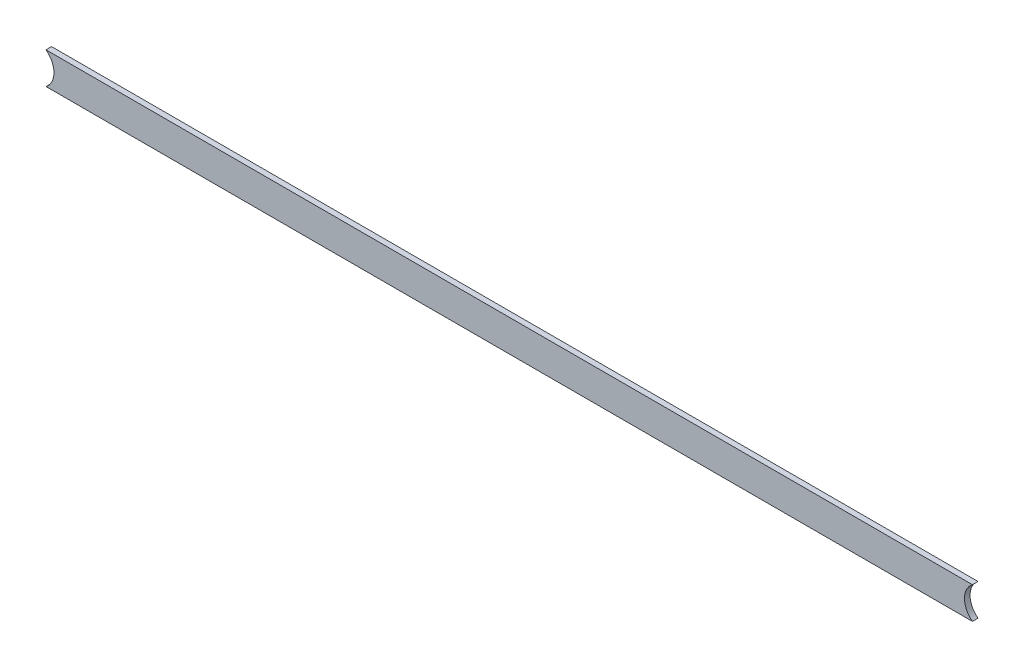
ISO-10303-21;
HEADER;
FILE_DESCRIPTION(('STEP AP214'),'2;1');
FILE_NAME('part.step','',(''),(''),'','','');
FILE_SCHEMA(('AUTOMOTIVE_DESIGN { 1 0 10303 214 1 1 1 1 }'));
ENDSEC;
DATA;
#1=APPLICATION_CONTEXT('core data for automotive mechanical design processes');
#2=APPLICATION_PROTOCOL_DEFINITION('international standard','automotive_design',2000,#1);
#3=PRODUCT_CONTEXT('',#1,'mechanical');
#4=PRODUCT('Part','Part','',(#3));
#5=PRODUCT_RELATED_PRODUCT_CATEGORY('part','',(#4));
#6=PRODUCT_DEFINITION_FORMATION('','',#4);
#7=PRODUCT_DEFINITION_CONTEXT('part definition',#1,'design');
#8=PRODUCT_DEFINITION('design','',#6,#7);
#9=PRODUCT_DEFINITION_SHAPE('','',#8);
#10=(LENGTH_UNIT() NAMED_UNIT(*) SI_UNIT(.MILLI.,.METRE.));
#11=(NAMED_UNIT(*) PLANE_ANGLE_UNIT() SI_UNIT($,.RADIAN.));
#12=(NAMED_UNIT(*) SI_UNIT($,.STERADIAN.) SOLID_ANGLE_UNIT());
#13=UNCERTAINTY_MEASURE_WITH_UNIT(LENGTH_MEASURE(1.E-05),#10,'distance_accuracy_value','');
#14=(GEOMETRIC_REPRESENTATION_CONTEXT(3) GLOBAL_UNCERTAINTY_ASSIGNED_CONTEXT((#13)) GLOBAL_UNIT_ASSIGNED_CONTEXT((#10,
#11,#12)) REPRESENTATION_CONTEXT('',''));
#15=CARTESIAN_POINT('',(0.,0.,0.));
#16=DIRECTION('',(0.,0.,1.));
#17=DIRECTION('',(1.,0.,0.));
#18=AXIS2_PLACEMENT_3D('',#15,#16,#17);
#19=CARTESIAN_POINT('',(86.125,-117.175,-0.035));
#20=DIRECTION('',(0.,1.,0.));
#21=DIRECTION('',(1.,0.,0.));
#22=AXIS2_PLACEMENT_3D('',#19,#20,#21);
#23=PLANE('',#22);
#24=DIRECTION('',(0.,0.,-1.));
#25=VECTOR('',#24,1.);
#26=CARTESIAN_POINT('',(92.025,-117.175,-0.045));
#27=LINE('',#26,#25);
#28=CARTESIAN_POINT('',(92.024999999999,-117.175,0.));
#29=VERTEX_POINT('',#28);
#30=CARTESIAN_POINT('',(92.024999999999,-117.175,-0.035));
#31=VERTEX_POINT('',#30);
#32=EDGE_CURVE('E11',#29,#31,#27,.T.);
#33=ORIENTED_EDGE('',*,*,#32,.F.);
#34=DIRECTION('',(1.,0.,0.));
#35=VECTOR('',#34,1.);
#36=CARTESIAN_POINT('',(86.125,-117.175,0.));
#37=LINE('',#36,#35);
#38=CARTESIAN_POINT('',(86.199999999938,-117.175,0.));
#39=VERTEX_POINT('',#38);
#40=EDGE_CURVE('E26',#39,#29,#37,.T.);
#41=ORIENTED_EDGE('',*,*,#40,.F.);
#42=DIRECTION('',(0.,0.,-1.));
#43=VECTOR('',#42,1.);
#44=CARTESIAN_POINT('',(86.2,-117.175,-0.045));
#45=LINE('',#44,#43);
#46=CARTESIAN_POINT('',(86.199999999938,-117.175,-0.035));
#47=VERTEX_POINT('',#46);
#48=EDGE_CURVE('E109',#39,#47,#45,.T.);
#49=ORIENTED_EDGE('',*,*,#48,.T.);
#50=DIRECTION('',(1.,0.,0.));
#51=VECTOR('',#50,1.);
#52=CARTESIAN_POINT('',(86.125,-117.175,-0.035));
#53=LINE('',#52,#51);
#54=EDGE_CURVE('E88',#47,#31,#53,.T.);
#55=ORIENTED_EDGE('',*,*,#54,.T.);
#56=EDGE_LOOP('',(#33,#41,#49,#55));
#57=FACE_BOUND('',#56,.T.);
#58=ADVANCED_FACE('F17',(#57),#23,.F.);
#59=CARTESIAN_POINT('',(92.1,-117.075,-0.045));
#60=DIRECTION('',(0.,0.,-1.));
#61=DIRECTION('',(0.,-1.,0.));
#62=AXIS2_PLACEMENT_3D('',#59,#60,#61);
#63=CYLINDRICAL_SURFACE('',#62,0.125);
#64=DIRECTION('',(0.,0.,-1.));
#65=VECTOR('',#64,1.);
#66=CARTESIAN_POINT('',(92.025,-116.975,-0.045));
#67=LINE('',#66,#65);
#68=CARTESIAN_POINT('',(92.024999999965,-116.975,0.));
#69=VERTEX_POINT('',#68);
#70=CARTESIAN_POINT('',(92.024999999965,-116.975,-0.035));
#71=VERTEX_POINT('',#70);
#72=EDGE_CURVE('E72',#69,#71,#67,.T.);
#73=ORIENTED_EDGE('',*,*,#72,.F.);
#74=CARTESIAN_POINT('',(92.1,-117.075,0.));
#75=DIRECTION('',(0.,0.,-1.));
#76=DIRECTION('',(0.,-1.,0.));
#77=AXIS2_PLACEMENT_3D('',#74,#75,#76);
#78=CIRCLE('',#77,0.125);
#79=EDGE_CURVE('E106',#29,#69,#78,.T.);
#80=ORIENTED_EDGE('',*,*,#79,.F.);
#81=ORIENTED_EDGE('',*,*,#32,.T.);
#82=CARTESIAN_POINT('',(92.1,-117.075,-0.035));
#83=DIRECTION('',(0.,0.,-1.));
#84=DIRECTION('',(0.,-1.,0.));
#85=AXIS2_PLACEMENT_3D('',#82,#83,#84);
#86=CIRCLE('',#85,0.125);
#87=EDGE_CURVE('E68',#31,#71,#86,.T.);
#88=ORIENTED_EDGE('',*,*,#87,.T.);
#89=EDGE_LOOP('',(#73,#80,#81,#88));
#90=FACE_BOUND('',#89,.T.);
#91=ADVANCED_FACE('F19',(#90),#63,.F.);
#92=CARTESIAN_POINT('',(92.1,-116.975,0.));
#93=DIRECTION('',(0.,0.,1.));
#94=DIRECTION('',(1.,0.,0.));
#95=AXIS2_PLACEMENT_3D('',#92,#93,#94);
#96=PLANE('',#95);
#97=ORIENTED_EDGE('',*,*,#79,.T.);
#98=DIRECTION('',(-1.,0.,0.));
#99=VECTOR('',#98,1.);
#100=CARTESIAN_POINT('',(92.1,-116.975,0.));
#101=LINE('',#100,#99);
#102=CARTESIAN_POINT('',(86.200000000001,-116.975,0.));
#103=VERTEX_POINT('',#102);
#104=EDGE_CURVE('E92',#69,#103,#101,.T.);
#105=ORIENTED_EDGE('',*,*,#104,.T.);
#106=CARTESIAN_POINT('',(86.125,-117.075,0.));
#107=DIRECTION('',(0.,0.,-1.));
#108=DIRECTION('',(0.,-1.,0.));
#109=AXIS2_PLACEMENT_3D('',#106,#107,#108);
#110=CIRCLE('',#109,0.125);
#111=EDGE_CURVE('E77',#103,#39,#110,.T.);
#112=ORIENTED_EDGE('',*,*,#111,.T.);
#113=ORIENTED_EDGE('',*,*,#40,.T.);
#114=EDGE_LOOP('',(#97,#105,#112,#113));
#115=FACE_BOUND('',#114,.T.);
#116=ADVANCED_FACE('F118',(#115),#96,.T.);
#117=CARTESIAN_POINT('',(86.125,-117.075,-0.045));
#118=DIRECTION('',(0.,0.,-1.));
#119=DIRECTION('',(0.,-1.,0.));
#120=AXIS2_PLACEMENT_3D('',#117,#118,#119);
#121=CYLINDRICAL_SURFACE('',#120,0.125);
#122=ORIENTED_EDGE('',*,*,#111,.F.);
#123=DIRECTION('',(0.,0.,-1.));
#124=VECTOR('',#123,1.);
#125=CARTESIAN_POINT('',(86.2,-116.975,-0.045));
#126=LINE('',#125,#124);
#127=CARTESIAN_POINT('',(86.200000000001,-116.975,-0.035));
#128=VERTEX_POINT('',#127);
#129=EDGE_CURVE('E99',#103,#128,#126,.T.);
#130=ORIENTED_EDGE('',*,*,#129,.T.);
#131=CARTESIAN_POINT('',(86.125,-117.075,-0.035));
#132=DIRECTION('',(0.,0.,-1.));
#133=DIRECTION('',(0.,-1.,0.));
#134=AXIS2_PLACEMENT_3D('',#131,#132,#133);
#135=CIRCLE('',#134,0.125);
#136=EDGE_CURVE('E78',#128,#47,#135,.T.);
#137=ORIENTED_EDGE('',*,*,#136,.T.);
#138=ORIENTED_EDGE('',*,*,#48,.F.);
#139=EDGE_LOOP('',(#122,#130,#137,#138));
#140=FACE_BOUND('',#139,.T.);
#141=ADVANCED_FACE('F120',(#140),#121,.F.);
#142=CARTESIAN_POINT('',(92.1,-116.975,-0.035));
#143=DIRECTION('',(0.,0.,1.));
#144=DIRECTION('',(1.,0.,0.));
#145=AXIS2_PLACEMENT_3D('',#142,#143,#144);
#146=PLANE('',#145);
#147=ORIENTED_EDGE('',*,*,#54,.F.);
#148=ORIENTED_EDGE('',*,*,#136,.F.);
#149=DIRECTION('',(-1.,0.,0.));
#150=VECTOR('',#149,1.);
#151=CARTESIAN_POINT('',(92.1,-116.975,-0.035));
#152=LINE('',#151,#150);
#153=EDGE_CURVE('E81',#71,#128,#152,.T.);
#154=ORIENTED_EDGE('',*,*,#153,.F.);
#155=ORIENTED_EDGE('',*,*,#87,.F.);
#156=EDGE_LOOP('',(#147,#148,#154,#155));
#157=FACE_BOUND('',#156,.T.);
#158=ADVANCED_FACE('F82',(#157),#146,.F.);
#159=CARTESIAN_POINT('',(92.1,-116.975,-0.035));
#160=DIRECTION('',(0.,-1.,0.));
#161=DIRECTION('',(0.,0.,-1.));
#162=AXIS2_PLACEMENT_3D('',#159,#160,#161);
#163=PLANE('',#162);
#164=ORIENTED_EDGE('',*,*,#129,.F.);
#165=ORIENTED_EDGE('',*,*,#104,.F.);
#166=ORIENTED_EDGE('',*,*,#72,.T.);
#167=ORIENTED_EDGE('',*,*,#153,.T.);
#168=EDGE_LOOP('',(#164,#165,#166,#167));
#169=FACE_BOUND('',#168,.T.);
#170=ADVANCED_FACE('F90',(#169),#163,.F.);
#171=CLOSED_SHELL('',(#58,#91,#116,#141,#158,#170));
#172=MANIFOLD_SOLID_BREP('B1',#171);
#173=ADVANCED_BREP_SHAPE_REPRESENTATION('',(#18,#172),#14);
#174=SHAPE_DEFINITION_REPRESENTATION(#9,#173);
ENDSEC;
END-ISO-10303-21;
